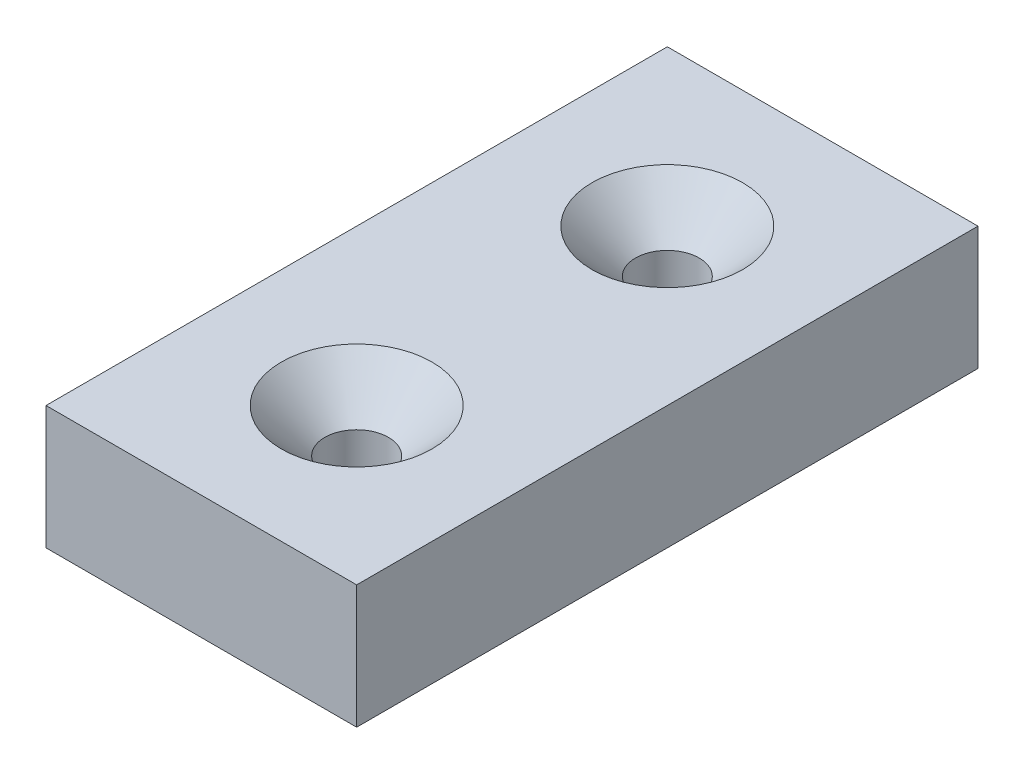
ISO-10303-21;
HEADER;
FILE_DESCRIPTION(('STEP AP214'),'2;1');
FILE_NAME('part.step','',(''),(''),'','','');
FILE_SCHEMA(('AUTOMOTIVE_DESIGN { 1 0 10303 214 1 1 1 1 }'));
ENDSEC;
DATA;
#1=APPLICATION_CONTEXT('core data for automotive mechanical design processes');
#2=APPLICATION_PROTOCOL_DEFINITION('international standard','automotive_design',2000,#1);
#3=PRODUCT_CONTEXT('',#1,'mechanical');
#4=PRODUCT('Part','Part','',(#3));
#5=PRODUCT_RELATED_PRODUCT_CATEGORY('part','',(#4));
#6=PRODUCT_DEFINITION_FORMATION('','',#4);
#7=PRODUCT_DEFINITION_CONTEXT('part definition',#1,'design');
#8=PRODUCT_DEFINITION('design','',#6,#7);
#9=PRODUCT_DEFINITION_SHAPE('','',#8);
#10=(LENGTH_UNIT() NAMED_UNIT(*) SI_UNIT(.MILLI.,.METRE.));
#11=(NAMED_UNIT(*) PLANE_ANGLE_UNIT() SI_UNIT($,.RADIAN.));
#12=(NAMED_UNIT(*) SI_UNIT($,.STERADIAN.) SOLID_ANGLE_UNIT());
#13=UNCERTAINTY_MEASURE_WITH_UNIT(LENGTH_MEASURE(1.E-05),#10,'distance_accuracy_value','');
#14=(GEOMETRIC_REPRESENTATION_CONTEXT(3) GLOBAL_UNCERTAINTY_ASSIGNED_CONTEXT((#13)) GLOBAL_UNIT_ASSIGNED_CONTEXT((#10,
#11,#12)) REPRESENTATION_CONTEXT('',''));
#15=CARTESIAN_POINT('',(0.,0.,0.));
#16=DIRECTION('',(0.,0.,1.));
#17=DIRECTION('',(1.,0.,0.));
#18=AXIS2_PLACEMENT_3D('',#15,#16,#17);
#19=CARTESIAN_POINT('',(0.,-102.131174647806,0.));
#20=DIRECTION('',(0.,1.,0.));
#21=DIRECTION('',(0.,0.,1.));
#22=AXIS2_PLACEMENT_3D('',#19,#20,#21);
#23=PLANE('',#22);
#24=CARTESIAN_POINT('',(68.3338642783942,-102.131174647806,72.627324847771));
#25=DIRECTION('',(0.,1.,0.));
#26=DIRECTION('',(0.,0.,1.));
#27=AXIS2_PLACEMENT_3D('',#24,#25,#26);
#28=CIRCLE('',#27,4.85000000000001);
#29=CARTESIAN_POINT('',(68.3338642783942,-102.131174647806,77.4773248477711));
#30=VERTEX_POINT('',#29);
#31=EDGE_CURVE('E42',#30,#30,#28,.F.);
#32=ORIENTED_EDGE('',*,*,#31,.T.);
#33=EDGE_LOOP('',(#32));
#34=FACE_BOUND('',#33,.T.);
#35=CARTESIAN_POINT('',(68.3338642783942,-102.131174647806,52.627324847771));
#36=DIRECTION('',(0.,1.,0.));
#37=DIRECTION('',(0.,0.,1.));
#38=AXIS2_PLACEMENT_3D('',#35,#36,#37);
#39=CIRCLE('',#38,4.85000000000001);
#40=CARTESIAN_POINT('',(68.3338642783942,-102.131174647806,57.477324847771));
#41=VERTEX_POINT('',#40);
#42=EDGE_CURVE('E113',#41,#41,#39,.F.);
#43=ORIENTED_EDGE('',*,*,#42,.T.);
#44=EDGE_LOOP('',(#43));
#45=FACE_BOUND('',#44,.T.);
#46=DIRECTION('',(0.,0.,-1.));
#47=VECTOR('',#46,1.);
#48=CARTESIAN_POINT('',(78.3338642783942,-102.131174647806,82.627324847771));
#49=LINE('',#48,#47);
#50=CARTESIAN_POINT('',(78.3338642783942,-102.131174647806,82.627324847771));
#51=VERTEX_POINT('',#50);
#52=CARTESIAN_POINT('',(78.3338642783942,-102.131174647806,42.627324847771));
#53=VERTEX_POINT('',#52);
#54=EDGE_CURVE('E85',#51,#53,#49,.T.);
#55=ORIENTED_EDGE('',*,*,#54,.T.);
#56=DIRECTION('',(-1.,0.,0.));
#57=VECTOR('',#56,1.);
#58=CARTESIAN_POINT('',(78.3338642783942,-102.131174647806,42.627324847771));
#59=LINE('',#58,#57);
#60=CARTESIAN_POINT('',(58.3338642783942,-102.131174647806,42.627324847771));
#61=VERTEX_POINT('',#60);
#62=EDGE_CURVE('E81',#53,#61,#59,.T.);
#63=ORIENTED_EDGE('',*,*,#62,.T.);
#64=DIRECTION('',(0.,0.,1.));
#65=VECTOR('',#64,1.);
#66=CARTESIAN_POINT('',(58.3338642783942,-102.131174647806,82.627324847771));
#67=LINE('',#66,#65);
#68=CARTESIAN_POINT('',(58.3338642783942,-102.131174647806,82.627324847771));
#69=VERTEX_POINT('',#68);
#70=EDGE_CURVE('E83',#61,#69,#67,.T.);
#71=ORIENTED_EDGE('',*,*,#70,.T.);
#72=DIRECTION('',(1.,0.,0.));
#73=VECTOR('',#72,1.);
#74=CARTESIAN_POINT('',(78.3338642783942,-102.131174647806,82.627324847771));
#75=LINE('',#74,#73);
#76=EDGE_CURVE('E50',#69,#51,#75,.T.);
#77=ORIENTED_EDGE('',*,*,#76,.T.);
#78=EDGE_LOOP('',(#55,#63,#71,#77));
#79=FACE_BOUND('',#78,.T.);
#80=ADVANCED_FACE('F33',(#34,#45,#79),#23,.T.);
#81=CARTESIAN_POINT('',(0.,-110.068674647806,0.));
#82=DIRECTION('',(0.,1.,0.));
#83=DIRECTION('',(0.,0.,1.));
#84=AXIS2_PLACEMENT_3D('',#81,#82,#83);
#85=PLANE('',#84);
#86=DIRECTION('',(0.,0.,-1.));
#87=VECTOR('',#86,1.);
#88=CARTESIAN_POINT('',(78.3338642783942,-110.068674647806,82.627324847771));
#89=LINE('',#88,#87);
#90=CARTESIAN_POINT('',(78.3338642783942,-110.068674647806,82.627324847771));
#91=VERTEX_POINT('',#90);
#92=CARTESIAN_POINT('',(78.3338642783942,-110.068674647806,42.627324847771));
#93=VERTEX_POINT('',#92);
#94=EDGE_CURVE('E100',#91,#93,#89,.T.);
#95=ORIENTED_EDGE('',*,*,#94,.F.);
#96=DIRECTION('',(1.,0.,0.));
#97=VECTOR('',#96,1.);
#98=CARTESIAN_POINT('',(78.3338642783942,-110.068674647806,82.627324847771));
#99=LINE('',#98,#97);
#100=CARTESIAN_POINT('',(58.3338642783942,-110.068674647806,82.627324847771));
#101=VERTEX_POINT('',#100);
#102=EDGE_CURVE('E73',#101,#91,#99,.T.);
#103=ORIENTED_EDGE('',*,*,#102,.F.);
#104=DIRECTION('',(0.,0.,1.));
#105=VECTOR('',#104,1.);
#106=CARTESIAN_POINT('',(58.3338642783942,-110.068674647806,82.627324847771));
#107=LINE('',#106,#105);
#108=CARTESIAN_POINT('',(58.3338642783942,-110.068674647806,42.627324847771));
#109=VERTEX_POINT('',#108);
#110=EDGE_CURVE('E67',#109,#101,#107,.T.);
#111=ORIENTED_EDGE('',*,*,#110,.F.);
#112=DIRECTION('',(-1.,0.,0.));
#113=VECTOR('',#112,1.);
#114=CARTESIAN_POINT('',(78.3338642783942,-110.068674647806,42.627324847771));
#115=LINE('',#114,#113);
#116=EDGE_CURVE('E90',#93,#109,#115,.T.);
#117=ORIENTED_EDGE('',*,*,#116,.F.);
#118=EDGE_LOOP('',(#95,#103,#111,#117));
#119=FACE_BOUND('',#118,.T.);
#120=CARTESIAN_POINT('',(68.3338642783942,-110.068674647806,72.627324847771));
#121=DIRECTION('',(0.,1.,0.));
#122=DIRECTION('',(0.,0.,1.));
#123=AXIS2_PLACEMENT_3D('',#120,#121,#122);
#124=CIRCLE('',#123,2.04999999999998);
#125=CARTESIAN_POINT('',(68.3338642783942,-110.068674647806,74.677324847771));
#126=VERTEX_POINT('',#125);
#127=EDGE_CURVE('E103',#126,#126,#124,.T.);
#128=ORIENTED_EDGE('',*,*,#127,.T.);
#129=EDGE_LOOP('',(#128));
#130=FACE_BOUND('',#129,.T.);
#131=CARTESIAN_POINT('',(68.3338642783942,-110.068674647806,52.627324847771));
#132=DIRECTION('',(0.,1.,0.));
#133=DIRECTION('',(0.,0.,1.));
#134=AXIS2_PLACEMENT_3D('',#131,#132,#133);
#135=CIRCLE('',#134,2.04999999999998);
#136=CARTESIAN_POINT('',(68.3338642783942,-110.068674647806,54.677324847771));
#137=VERTEX_POINT('',#136);
#138=EDGE_CURVE('E134',#137,#137,#135,.T.);
#139=ORIENTED_EDGE('',*,*,#138,.T.);
#140=EDGE_LOOP('',(#139));
#141=FACE_BOUND('',#140,.T.);
#142=ADVANCED_FACE('F140',(#119,#130,#141),#85,.F.);
#143=CARTESIAN_POINT('',(78.3338642783942,-102.131174647806,82.627324847771));
#144=DIRECTION('',(-1.,0.,0.));
#145=DIRECTION('',(0.,0.,1.));
#146=AXIS2_PLACEMENT_3D('',#143,#144,#145);
#147=PLANE('',#146);
#148=ORIENTED_EDGE('',*,*,#94,.T.);
#149=DIRECTION('',(0.,-1.,0.));
#150=VECTOR('',#149,1.);
#151=CARTESIAN_POINT('',(78.3338642783942,-102.131174647806,42.627324847771));
#152=LINE('',#151,#150);
#153=EDGE_CURVE('E91',#53,#93,#152,.T.);
#154=ORIENTED_EDGE('',*,*,#153,.F.);
#155=ORIENTED_EDGE('',*,*,#54,.F.);
#156=DIRECTION('',(0.,-1.,0.));
#157=VECTOR('',#156,1.);
#158=CARTESIAN_POINT('',(78.3338642783942,-102.131174647806,82.627324847771));
#159=LINE('',#158,#157);
#160=EDGE_CURVE('E96',#51,#91,#159,.T.);
#161=ORIENTED_EDGE('',*,*,#160,.T.);
#162=EDGE_LOOP('',(#148,#154,#155,#161));
#163=FACE_BOUND('',#162,.T.);
#164=ADVANCED_FACE('F152',(#163),#147,.F.);
#165=CARTESIAN_POINT('',(78.3338642783942,-102.131174647806,42.627324847771));
#166=DIRECTION('',(0.,0.,1.));
#167=DIRECTION('',(1.,0.,0.));
#168=AXIS2_PLACEMENT_3D('',#165,#166,#167);
#169=PLANE('',#168);
#170=ORIENTED_EDGE('',*,*,#116,.T.);
#171=DIRECTION('',(0.,-1.,0.));
#172=VECTOR('',#171,1.);
#173=CARTESIAN_POINT('',(58.3338642783942,-102.131174647806,42.627324847771));
#174=LINE('',#173,#172);
#175=EDGE_CURVE('E88',#61,#109,#174,.T.);
#176=ORIENTED_EDGE('',*,*,#175,.F.);
#177=ORIENTED_EDGE('',*,*,#62,.F.);
#178=ORIENTED_EDGE('',*,*,#153,.T.);
#179=EDGE_LOOP('',(#170,#176,#177,#178));
#180=FACE_BOUND('',#179,.T.);
#181=ADVANCED_FACE('F89',(#180),#169,.F.);
#182=CARTESIAN_POINT('',(58.3338642783942,-102.131174647806,82.627324847771));
#183=DIRECTION('',(1.,0.,0.));
#184=DIRECTION('',(0.,0.,-1.));
#185=AXIS2_PLACEMENT_3D('',#182,#183,#184);
#186=PLANE('',#185);
#187=ORIENTED_EDGE('',*,*,#110,.T.);
#188=DIRECTION('',(0.,-1.,0.));
#189=VECTOR('',#188,1.);
#190=CARTESIAN_POINT('',(58.3338642783942,-102.131174647806,82.627324847771));
#191=LINE('',#190,#189);
#192=EDGE_CURVE('E92',#69,#101,#191,.T.);
#193=ORIENTED_EDGE('',*,*,#192,.F.);
#194=ORIENTED_EDGE('',*,*,#70,.F.);
#195=ORIENTED_EDGE('',*,*,#175,.T.);
#196=EDGE_LOOP('',(#187,#193,#194,#195));
#197=FACE_BOUND('',#196,.T.);
#198=ADVANCED_FACE('F94',(#197),#186,.F.);
#199=CARTESIAN_POINT('',(78.3338642783942,-102.131174647806,82.627324847771));
#200=DIRECTION('',(0.,0.,-1.));
#201=DIRECTION('',(-1.,0.,0.));
#202=AXIS2_PLACEMENT_3D('',#199,#200,#201);
#203=PLANE('',#202);
#204=ORIENTED_EDGE('',*,*,#102,.T.);
#205=ORIENTED_EDGE('',*,*,#160,.F.);
#206=ORIENTED_EDGE('',*,*,#76,.F.);
#207=ORIENTED_EDGE('',*,*,#192,.T.);
#208=EDGE_LOOP('',(#204,#205,#206,#207));
#209=FACE_BOUND('',#208,.T.);
#210=ADVANCED_FACE('F129',(#209),#203,.F.);
#211=CARTESIAN_POINT('',(68.3338642783942,-102.131174647806,72.627324847771));
#212=DIRECTION('',(0.,-1.,0.));
#213=DIRECTION('',(0.,0.,-1.));
#214=AXIS2_PLACEMENT_3D('',#211,#212,#213);
#215=CYLINDRICAL_SURFACE('',#214,2.04999999999998);
#216=CARTESIAN_POINT('',(68.3338642783942,-104.931174647806,72.627324847771));
#217=DIRECTION('',(0.,1.,0.));
#218=DIRECTION('',(0.,0.,1.));
#219=AXIS2_PLACEMENT_3D('',#216,#217,#218);
#220=CIRCLE('',#219,2.04999999999998);
#221=CARTESIAN_POINT('',(68.3338642783942,-104.931174647806,74.677324847771));
#222=VERTEX_POINT('',#221);
#223=EDGE_CURVE('E110',#222,#222,#220,.T.);
#224=ORIENTED_EDGE('',*,*,#223,.T.);
#225=EDGE_LOOP('',(#224));
#226=FACE_BOUND('',#225,.T.);
#227=ORIENTED_EDGE('',*,*,#127,.F.);
#228=EDGE_LOOP('',(#227));
#229=FACE_BOUND('',#228,.T.);
#230=ADVANCED_FACE('F126',(#226,#229),#215,.F.);
#231=CARTESIAN_POINT('',(68.3338642783942,-102.131174647806,52.627324847771));
#232=DIRECTION('',(0.,-1.,0.));
#233=DIRECTION('',(0.,0.,-1.));
#234=AXIS2_PLACEMENT_3D('',#231,#232,#233);
#235=CYLINDRICAL_SURFACE('',#234,2.04999999999998);
#236=CARTESIAN_POINT('',(68.3338642783942,-104.931174647806,52.627324847771));
#237=DIRECTION('',(0.,1.,0.));
#238=DIRECTION('',(0.,0.,1.));
#239=AXIS2_PLACEMENT_3D('',#236,#237,#238);
#240=CIRCLE('',#239,2.04999999999998);
#241=CARTESIAN_POINT('',(68.3338642783942,-104.931174647806,54.677324847771));
#242=VERTEX_POINT('',#241);
#243=EDGE_CURVE('E11',#242,#242,#240,.T.);
#244=ORIENTED_EDGE('',*,*,#243,.T.);
#245=EDGE_LOOP('',(#244));
#246=FACE_BOUND('',#245,.T.);
#247=ORIENTED_EDGE('',*,*,#138,.F.);
#248=EDGE_LOOP('',(#247));
#249=FACE_BOUND('',#248,.T.);
#250=ADVANCED_FACE('F123',(#246,#249),#235,.F.);
#251=CARTESIAN_POINT('',(68.3338642783942,-104.931174647806,72.627324847771));
#252=DIRECTION('',(0.,1.,0.));
#253=DIRECTION('',(0.,0.,1.));
#254=AXIS2_PLACEMENT_3D('',#251,#252,#253);
#255=CONICAL_SURFACE('',#254,2.04999999999998,0.785398163397454);
#256=CARTESIAN_POINT('',(68.3338642783942,-102.131174647806,77.4773248477711));
#257=CARTESIAN_POINT('',(68.3338642783942,-102.160341314473,77.4481581811044));
#258=CARTESIAN_POINT('',(68.3338642783942,-102.18950798114,77.4189915144377));
#259=CARTESIAN_POINT('',(68.3338642783942,-102.247841314473,77.3606581811044));
#260=CARTESIAN_POINT('',(68.3338642783942,-102.27700798114,77.3314915144377));
#261=CARTESIAN_POINT('',(68.3338642783942,-102.335341314473,77.2731581811044));
#262=CARTESIAN_POINT('',(68.3338642783942,-102.36450798114,77.2439915144377));
#263=CARTESIAN_POINT('',(68.3338642783942,-102.422841314473,77.1856581811044));
#264=CARTESIAN_POINT('',(68.3338642783942,-102.45200798114,77.1564915144377));
#265=CARTESIAN_POINT('',(68.3338642783942,-102.510341314473,77.0981581811044));
#266=CARTESIAN_POINT('',(68.3338642783942,-102.53950798114,77.0689915144377));
#267=CARTESIAN_POINT('',(68.3338642783942,-102.597841314473,77.0106581811044));
#268=CARTESIAN_POINT('',(68.3338642783942,-102.62700798114,76.9814915144377));
#269=CARTESIAN_POINT('',(68.3338642783942,-102.685341314473,76.9231581811044));
#270=CARTESIAN_POINT('',(68.3338642783942,-102.71450798114,76.8939915144377));
#271=CARTESIAN_POINT('',(68.3338642783942,-102.772841314473,76.8356581811044));
#272=CARTESIAN_POINT('',(68.3338642783942,-102.80200798114,76.8064915144377));
#273=CARTESIAN_POINT('',(68.3338642783942,-102.860341314473,76.7481581811044));
#274=CARTESIAN_POINT('',(68.3338642783942,-102.88950798114,76.7189915144377));
#275=CARTESIAN_POINT('',(68.3338642783942,-102.947841314473,76.6606581811044));
#276=CARTESIAN_POINT('',(68.3338642783942,-102.97700798114,76.6314915144377));
#277=CARTESIAN_POINT('',(68.3338642783942,-103.035341314473,76.5731581811044));
#278=CARTESIAN_POINT('',(68.3338642783942,-103.06450798114,76.5439915144377));
#279=CARTESIAN_POINT('',(68.3338642783942,-103.122841314473,76.4856581811044));
#280=CARTESIAN_POINT('',(68.3338642783942,-103.15200798114,76.4564915144377));
#281=CARTESIAN_POINT('',(68.3338642783942,-103.210341314473,76.3981581811044));
#282=CARTESIAN_POINT('',(68.3338642783942,-103.23950798114,76.3689915144377));
#283=CARTESIAN_POINT('',(68.3338642783942,-103.297841314473,76.3106581811044));
#284=CARTESIAN_POINT('',(68.3338642783942,-103.32700798114,76.2814915144377));
#285=CARTESIAN_POINT('',(68.3338642783942,-103.385341314473,76.2231581811044));
#286=CARTESIAN_POINT('',(68.3338642783942,-103.41450798114,76.1939915144377));
#287=CARTESIAN_POINT('',(68.3338642783942,-103.472841314473,76.1356581811044));
#288=CARTESIAN_POINT('',(68.3338642783942,-103.50200798114,76.1064915144377));
#289=CARTESIAN_POINT('',(68.3338642783942,-103.560341314473,76.0481581811044));
#290=CARTESIAN_POINT('',(68.3338642783942,-103.58950798114,76.0189915144377));
#291=CARTESIAN_POINT('',(68.3338642783942,-103.647841314473,75.9606581811044));
#292=CARTESIAN_POINT('',(68.3338642783942,-103.67700798114,75.9314915144377));
#293=CARTESIAN_POINT('',(68.3338642783942,-103.735341314473,75.8731581811044));
#294=CARTESIAN_POINT('',(68.3338642783942,-103.76450798114,75.8439915144377));
#295=CARTESIAN_POINT('',(68.3338642783942,-103.822841314473,75.7856581811044));
#296=CARTESIAN_POINT('',(68.3338642783942,-103.85200798114,75.7564915144377));
#297=CARTESIAN_POINT('',(68.3338642783942,-103.910341314473,75.6981581811044));
#298=CARTESIAN_POINT('',(68.3338642783942,-103.93950798114,75.6689915144377));
#299=CARTESIAN_POINT('',(68.3338642783942,-103.997841314473,75.6106581811044));
#300=CARTESIAN_POINT('',(68.3338642783942,-104.02700798114,75.5814915144377));
#301=CARTESIAN_POINT('',(68.3338642783942,-104.085341314473,75.5231581811044));
#302=CARTESIAN_POINT('',(68.3338642783942,-104.11450798114,75.4939915144377));
#303=CARTESIAN_POINT('',(68.3338642783942,-104.172841314473,75.4356581811044));
#304=CARTESIAN_POINT('',(68.3338642783942,-104.20200798114,75.4064915144377));
#305=CARTESIAN_POINT('',(68.3338642783942,-104.260341314473,75.3481581811044));
#306=CARTESIAN_POINT('',(68.3338642783942,-104.28950798114,75.3189915144377));
#307=CARTESIAN_POINT('',(68.3338642783942,-104.347841314473,75.2606581811044));
#308=CARTESIAN_POINT('',(68.3338642783942,-104.37700798114,75.2314915144377));
#309=CARTESIAN_POINT('',(68.3338642783942,-104.435341314473,75.1731581811044));
#310=CARTESIAN_POINT('',(68.3338642783942,-104.46450798114,75.1439915144377));
#311=CARTESIAN_POINT('',(68.3338642783942,-104.522841314473,75.0856581811044));
#312=CARTESIAN_POINT('',(68.3338642783942,-104.55200798114,75.0564915144377));
#313=CARTESIAN_POINT('',(68.3338642783942,-104.610341314473,74.9981581811044));
#314=CARTESIAN_POINT('',(68.3338642783942,-104.63950798114,74.9689915144377));
#315=CARTESIAN_POINT('',(68.3338642783942,-104.697841314473,74.9106581811044));
#316=CARTESIAN_POINT('',(68.3338642783942,-104.72700798114,74.8814915144377));
#317=CARTESIAN_POINT('',(68.3338642783942,-104.785341314473,74.8231581811044));
#318=CARTESIAN_POINT('',(68.3338642783942,-104.81450798114,74.7939915144377));
#319=CARTESIAN_POINT('',(68.3338642783942,-104.872841314473,74.7356581811044));
#320=CARTESIAN_POINT('',(68.3338642783942,-104.90200798114,74.7064915144377));
#321=CARTESIAN_POINT('',(68.3338642783942,-104.931174647806,74.677324847771));
#322=B_SPLINE_CURVE_WITH_KNOTS('',3,(#256,#257,#258,#259,#260,#261,#262,#263,#264,#265,#266,
#267,#268,#269,#270,#271,#272,#273,#274,#275,#276,#277,#278,#279,#280,#281,#282,#283,#284,#285,
#286,#287,#288,#289,#290,#291,#292,#293,#294,#295,#296,#297,#298,#299,#300,#301,#302,#303,#304,
#305,#306,#307,#308,#309,#310,#311,#312,#313,#314,#315,#316,#317,#318,#319,#320,#321),
.UNSPECIFIED.,.F.,.F.,(4,2,2,2,2,2,2,2,2,2,2,2,2,2,2,2,2,2,2,2,2,2,2,2,2,2,2,2,2,2,2,2,4),(0.,
0.123743686707652,0.247487373415304,0.371231060122955,0.494974746830597,0.618718433538239,
0.742462120245891,0.866205806953533,0.989949493661175,1.11369318036883,1.23743686707647,
1.36118055378412,1.48492424049177,1.6086679271994,1.73241161390706,1.85615530061471,
1.97989898732235,2.10364267402999,2.22738636073764,2.3511300474453,2.47487373415294,
2.59861742086058,2.72236110756823,2.84610479427587,2.96984848098353,3.09359216769117,
3.21733585439881,3.34107954110646,3.46482322781411,3.58856691452174,3.7123106012294,
3.83605428793705,3.95979797464469),.UNSPECIFIED.);
#323=EDGE_CURVE('BSEAM120',#30,#222,#322,.T.);
#324=ORIENTED_EDGE('',*,*,#31,.F.);
#325=ORIENTED_EDGE('',*,*,#223,.F.);
#326=ORIENTED_EDGE('',*,*,#323,.T.);
#327=ORIENTED_EDGE('',*,*,#323,.F.);
#328=EDGE_LOOP('',(#324,#326,#325,#327));
#329=FACE_BOUND('',#328,.T.);
#330=ADVANCED_FACE('F120',(#329),#255,.F.);
#331=CARTESIAN_POINT('',(68.3338642783942,-104.931174647806,52.627324847771));
#332=DIRECTION('',(0.,1.,0.));
#333=DIRECTION('',(0.,0.,1.));
#334=AXIS2_PLACEMENT_3D('',#331,#332,#333);
#335=CONICAL_SURFACE('',#334,2.04999999999998,0.785398163397454);
#336=CARTESIAN_POINT('',(68.3338642783942,-102.131174647806,57.477324847771));
#337=CARTESIAN_POINT('',(68.3338642783942,-102.160341314473,57.4481581811044));
#338=CARTESIAN_POINT('',(68.3338642783942,-102.18950798114,57.4189915144377));
#339=CARTESIAN_POINT('',(68.3338642783942,-102.247841314473,57.3606581811044));
#340=CARTESIAN_POINT('',(68.3338642783942,-102.27700798114,57.3314915144377));
#341=CARTESIAN_POINT('',(68.3338642783942,-102.335341314473,57.2731581811044));
#342=CARTESIAN_POINT('',(68.3338642783942,-102.36450798114,57.2439915144377));
#343=CARTESIAN_POINT('',(68.3338642783942,-102.422841314473,57.1856581811044));
#344=CARTESIAN_POINT('',(68.3338642783942,-102.45200798114,57.1564915144377));
#345=CARTESIAN_POINT('',(68.3338642783942,-102.510341314473,57.0981581811044));
#346=CARTESIAN_POINT('',(68.3338642783942,-102.53950798114,57.0689915144377));
#347=CARTESIAN_POINT('',(68.3338642783942,-102.597841314473,57.0106581811044));
#348=CARTESIAN_POINT('',(68.3338642783942,-102.62700798114,56.9814915144377));
#349=CARTESIAN_POINT('',(68.3338642783942,-102.685341314473,56.9231581811044));
#350=CARTESIAN_POINT('',(68.3338642783942,-102.71450798114,56.8939915144377));
#351=CARTESIAN_POINT('',(68.3338642783942,-102.772841314473,56.8356581811044));
#352=CARTESIAN_POINT('',(68.3338642783942,-102.80200798114,56.8064915144377));
#353=CARTESIAN_POINT('',(68.3338642783942,-102.860341314473,56.7481581811044));
#354=CARTESIAN_POINT('',(68.3338642783942,-102.88950798114,56.7189915144377));
#355=CARTESIAN_POINT('',(68.3338642783942,-102.947841314473,56.6606581811044));
#356=CARTESIAN_POINT('',(68.3338642783942,-102.97700798114,56.6314915144377));
#357=CARTESIAN_POINT('',(68.3338642783942,-103.035341314473,56.5731581811044));
#358=CARTESIAN_POINT('',(68.3338642783942,-103.06450798114,56.5439915144377));
#359=CARTESIAN_POINT('',(68.3338642783942,-103.122841314473,56.4856581811044));
#360=CARTESIAN_POINT('',(68.3338642783942,-103.15200798114,56.4564915144377));
#361=CARTESIAN_POINT('',(68.3338642783942,-103.210341314473,56.3981581811044));
#362=CARTESIAN_POINT('',(68.3338642783942,-103.23950798114,56.3689915144377));
#363=CARTESIAN_POINT('',(68.3338642783942,-103.297841314473,56.3106581811044));
#364=CARTESIAN_POINT('',(68.3338642783942,-103.32700798114,56.2814915144377));
#365=CARTESIAN_POINT('',(68.3338642783942,-103.385341314473,56.2231581811044));
#366=CARTESIAN_POINT('',(68.3338642783942,-103.41450798114,56.1939915144377));
#367=CARTESIAN_POINT('',(68.3338642783942,-103.472841314473,56.1356581811044));
#368=CARTESIAN_POINT('',(68.3338642783942,-103.50200798114,56.1064915144377));
#369=CARTESIAN_POINT('',(68.3338642783942,-103.560341314473,56.0481581811044));
#370=CARTESIAN_POINT('',(68.3338642783942,-103.58950798114,56.0189915144377));
#371=CARTESIAN_POINT('',(68.3338642783942,-103.647841314473,55.9606581811044));
#372=CARTESIAN_POINT('',(68.3338642783942,-103.67700798114,55.9314915144377));
#373=CARTESIAN_POINT('',(68.3338642783942,-103.735341314473,55.8731581811044));
#374=CARTESIAN_POINT('',(68.3338642783942,-103.76450798114,55.8439915144377));
#375=CARTESIAN_POINT('',(68.3338642783942,-103.822841314473,55.7856581811044));
#376=CARTESIAN_POINT('',(68.3338642783942,-103.85200798114,55.7564915144377));
#377=CARTESIAN_POINT('',(68.3338642783942,-103.910341314473,55.6981581811044));
#378=CARTESIAN_POINT('',(68.3338642783942,-103.93950798114,55.6689915144377));
#379=CARTESIAN_POINT('',(68.3338642783942,-103.997841314473,55.6106581811044));
#380=CARTESIAN_POINT('',(68.3338642783942,-104.02700798114,55.5814915144377));
#381=CARTESIAN_POINT('',(68.3338642783942,-104.085341314473,55.5231581811044));
#382=CARTESIAN_POINT('',(68.3338642783942,-104.11450798114,55.4939915144377));
#383=CARTESIAN_POINT('',(68.3338642783942,-104.172841314473,55.4356581811043));
#384=CARTESIAN_POINT('',(68.3338642783942,-104.20200798114,55.4064915144377));
#385=CARTESIAN_POINT('',(68.3338642783942,-104.260341314473,55.3481581811044));
#386=CARTESIAN_POINT('',(68.3338642783942,-104.28950798114,55.3189915144377));
#387=CARTESIAN_POINT('',(68.3338642783942,-104.347841314473,55.2606581811044));
#388=CARTESIAN_POINT('',(68.3338642783942,-104.37700798114,55.2314915144377));
#389=CARTESIAN_POINT('',(68.3338642783942,-104.435341314473,55.1731581811043));
#390=CARTESIAN_POINT('',(68.3338642783942,-104.46450798114,55.1439915144377));
#391=CARTESIAN_POINT('',(68.3338642783942,-104.522841314473,55.0856581811043));
#392=CARTESIAN_POINT('',(68.3338642783942,-104.55200798114,55.0564915144377));
#393=CARTESIAN_POINT('',(68.3338642783942,-104.610341314473,54.9981581811044));
#394=CARTESIAN_POINT('',(68.3338642783942,-104.63950798114,54.9689915144377));
#395=CARTESIAN_POINT('',(68.3338642783942,-104.697841314473,54.9106581811043));
#396=CARTESIAN_POINT('',(68.3338642783942,-104.72700798114,54.8814915144377));
#397=CARTESIAN_POINT('',(68.3338642783942,-104.785341314473,54.8231581811044));
#398=CARTESIAN_POINT('',(68.3338642783942,-104.81450798114,54.7939915144377));
#399=CARTESIAN_POINT('',(68.3338642783942,-104.872841314473,54.7356581811043));
#400=CARTESIAN_POINT('',(68.3338642783942,-104.90200798114,54.7064915144377));
#401=CARTESIAN_POINT('',(68.3338642783942,-104.931174647806,54.677324847771));
#402=B_SPLINE_CURVE_WITH_KNOTS('',3,(#336,#337,#338,#339,#340,#341,#342,#343,#344,#345,#346,
#347,#348,#349,#350,#351,#352,#353,#354,#355,#356,#357,#358,#359,#360,#361,#362,#363,#364,#365,
#366,#367,#368,#369,#370,#371,#372,#373,#374,#375,#376,#377,#378,#379,#380,#381,#382,#383,#384,
#385,#386,#387,#388,#389,#390,#391,#392,#393,#394,#395,#396,#397,#398,#399,#400,#401),
.UNSPECIFIED.,.F.,.F.,(4,2,2,2,2,2,2,2,2,2,2,2,2,2,2,2,2,2,2,2,2,2,2,2,2,2,2,2,2,2,2,2,4),(0.,
0.123743686707647,0.247487373415299,0.371231060122951,0.494974746830588,0.618718433538235,
0.742462120245886,0.866205806953528,0.989949493661175,1.11369318036882,1.23743686707646,
1.36118055378412,1.48492424049176,1.6086679271994,1.73241161390705,1.8561553006147,
1.97989898732234,2.10364267402999,2.22738636073764,2.35113004744529,2.47487373415293,
2.59861742086058,2.72236110756823,2.84610479427587,2.96984848098352,3.09359216769117,
3.2173358543988,3.34107954110646,3.4648232278141,3.58856691452174,3.71231060122939,
3.83605428793704,3.95979797464469),.UNSPECIFIED.);
#403=EDGE_CURVE('BSEAM35',#41,#242,#402,.T.);
#404=ORIENTED_EDGE('',*,*,#42,.F.);
#405=ORIENTED_EDGE('',*,*,#243,.F.);
#406=ORIENTED_EDGE('',*,*,#403,.T.);
#407=ORIENTED_EDGE('',*,*,#403,.F.);
#408=EDGE_LOOP('',(#404,#406,#405,#407));
#409=FACE_BOUND('',#408,.T.);
#410=ADVANCED_FACE('F35',(#409),#335,.F.);
#411=CLOSED_SHELL('',(#80,#142,#164,#181,#198,#210,#230,#250,#330,#410));
#412=MANIFOLD_SOLID_BREP('B2',#411);
#413=ADVANCED_BREP_SHAPE_REPRESENTATION('',(#18,#412),#14);
#414=SHAPE_DEFINITION_REPRESENTATION(#9,#413);
ENDSEC;
END-ISO-10303-21;
